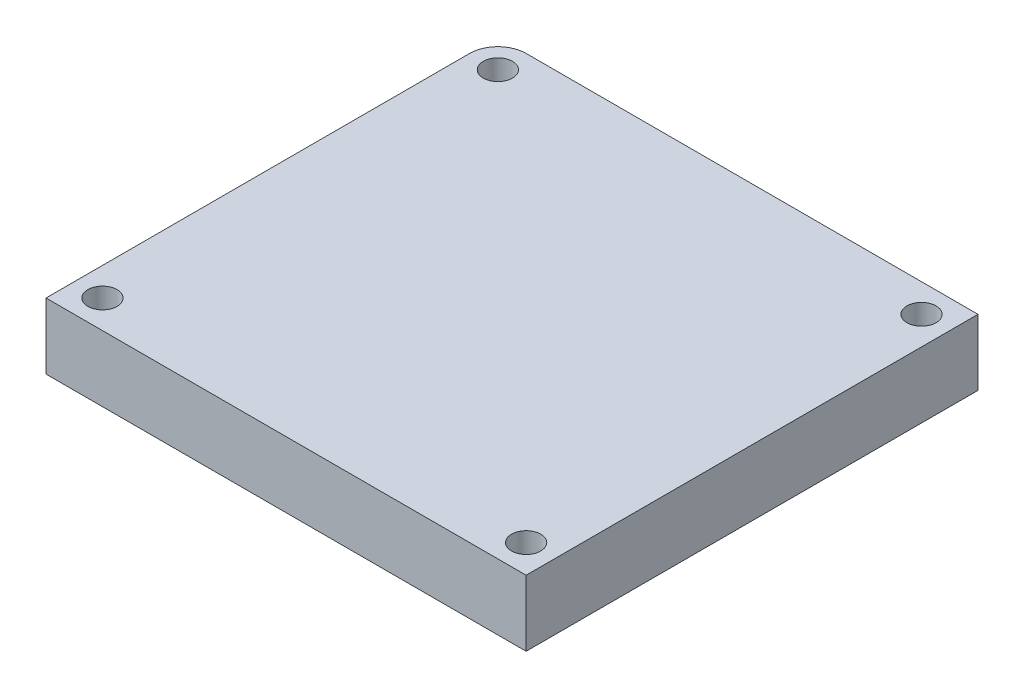
ISO-10303-21;
HEADER;
FILE_DESCRIPTION(('STEP AP214'),'2;1');
FILE_NAME('part.step','',(''),(''),'','','');
FILE_SCHEMA(('AUTOMOTIVE_DESIGN { 1 0 10303 214 1 1 1 1 }'));
ENDSEC;
DATA;
#1=APPLICATION_CONTEXT('core data for automotive mechanical design processes');
#2=APPLICATION_PROTOCOL_DEFINITION('international standard','automotive_design',2000,#1);
#3=PRODUCT_CONTEXT('',#1,'mechanical');
#4=PRODUCT('Part','Part','',(#3));
#5=PRODUCT_RELATED_PRODUCT_CATEGORY('part','',(#4));
#6=PRODUCT_DEFINITION_FORMATION('','',#4);
#7=PRODUCT_DEFINITION_CONTEXT('part definition',#1,'design');
#8=PRODUCT_DEFINITION('design','',#6,#7);
#9=PRODUCT_DEFINITION_SHAPE('','',#8);
#10=(LENGTH_UNIT() NAMED_UNIT(*) SI_UNIT(.MILLI.,.METRE.));
#11=(NAMED_UNIT(*) PLANE_ANGLE_UNIT() SI_UNIT($,.RADIAN.));
#12=(NAMED_UNIT(*) SI_UNIT($,.STERADIAN.) SOLID_ANGLE_UNIT());
#13=UNCERTAINTY_MEASURE_WITH_UNIT(LENGTH_MEASURE(1.E-05),#10,'distance_accuracy_value','');
#14=(GEOMETRIC_REPRESENTATION_CONTEXT(3) GLOBAL_UNCERTAINTY_ASSIGNED_CONTEXT((#13)) GLOBAL_UNIT_ASSIGNED_CONTEXT((#10,
#11,#12)) REPRESENTATION_CONTEXT('',''));
#15=CARTESIAN_POINT('',(0.,0.,0.));
#16=DIRECTION('',(0.,0.,1.));
#17=DIRECTION('',(1.,0.,0.));
#18=AXIS2_PLACEMENT_3D('',#15,#16,#17);
#19=CARTESIAN_POINT('',(-91.4412135173177,7.,-19.4052744204179));
#20=DIRECTION('',(0.,-1.,0.));
#21=DIRECTION('',(0.,0.,-1.));
#22=AXIS2_PLACEMENT_3D('',#19,#20,#21);
#23=CYLINDRICAL_SURFACE('',#22,3.);
#24=CARTESIAN_POINT('',(-91.4412135173177,0.,-19.4052744204179));
#25=DIRECTION('',(0.,1.,0.));
#26=DIRECTION('',(0.,0.,1.));
#27=AXIS2_PLACEMENT_3D('',#24,#25,#26);
#28=CIRCLE('',#27,3.);
#29=CARTESIAN_POINT('',(-94.4412135173177,0.,-19.4052744204179));
#30=VERTEX_POINT('',#29);
#31=CARTESIAN_POINT('',(-91.4412135173177,0.,-22.4052744204179));
#32=VERTEX_POINT('',#31);
#33=EDGE_CURVE('E121',#30,#32,#28,.F.);
#34=ORIENTED_EDGE('',*,*,#33,.F.);
#35=DIRECTION('',(0.,-1.,0.));
#36=VECTOR('',#35,1.);
#37=CARTESIAN_POINT('',(-94.4412135173177,7.,-19.4052744204179));
#38=LINE('',#37,#36);
#39=CARTESIAN_POINT('',(-94.4412135173177,7.,-19.4052744204179));
#40=VERTEX_POINT('',#39);
#41=EDGE_CURVE('E11',#40,#30,#38,.T.);
#42=ORIENTED_EDGE('',*,*,#41,.F.);
#43=CARTESIAN_POINT('',(-91.4412135173177,7.,-19.4052744204179));
#44=DIRECTION('',(0.,1.,0.));
#45=DIRECTION('',(0.,0.,1.));
#46=AXIS2_PLACEMENT_3D('',#43,#44,#45);
#47=CIRCLE('',#46,3.);
#48=CARTESIAN_POINT('',(-91.4412135173177,7.,-22.4052744204179));
#49=VERTEX_POINT('',#48);
#50=EDGE_CURVE('E144',#40,#49,#47,.F.);
#51=ORIENTED_EDGE('',*,*,#50,.T.);
#52=DIRECTION('',(0.,-1.,0.));
#53=VECTOR('',#52,1.);
#54=CARTESIAN_POINT('',(-91.4412135173177,7.,-22.4052744204179));
#55=LINE('',#54,#53);
#56=EDGE_CURVE('E51',#49,#32,#55,.T.);
#57=ORIENTED_EDGE('',*,*,#56,.T.);
#58=EDGE_LOOP('',(#34,#42,#51,#57));
#59=FACE_BOUND('',#58,.T.);
#60=ADVANCED_FACE('F35',(#59),#23,.T.);
#61=CARTESIAN_POINT('',(-94.4412135173177,7.,0.));
#62=DIRECTION('',(-1.,0.,0.));
#63=DIRECTION('',(0.,0.,1.));
#64=AXIS2_PLACEMENT_3D('',#61,#62,#63);
#65=PLANE('',#64);
#66=DIRECTION('',(0.,0.,-1.));
#67=VECTOR('',#66,1.);
#68=CARTESIAN_POINT('',(-94.4412135173177,0.,0.));
#69=LINE('',#68,#67);
#70=CARTESIAN_POINT('',(-94.4412135173177,0.,25.5947255795821));
#71=VERTEX_POINT('',#70);
#72=EDGE_CURVE('E123',#71,#30,#69,.T.);
#73=ORIENTED_EDGE('',*,*,#72,.F.);
#74=DIRECTION('',(0.,-1.,0.));
#75=VECTOR('',#74,1.);
#76=CARTESIAN_POINT('',(-94.4412135173177,7.,25.5947255795821));
#77=LINE('',#76,#75);
#78=CARTESIAN_POINT('',(-94.4412135173177,7.,25.5947255795821));
#79=VERTEX_POINT('',#78);
#80=EDGE_CURVE('E43',#79,#71,#77,.T.);
#81=ORIENTED_EDGE('',*,*,#80,.F.);
#82=DIRECTION('',(0.,0.,-1.));
#83=VECTOR('',#82,1.);
#84=CARTESIAN_POINT('',(-94.4412135173177,7.,0.));
#85=LINE('',#84,#83);
#86=EDGE_CURVE('E92',#79,#40,#85,.T.);
#87=ORIENTED_EDGE('',*,*,#86,.T.);
#88=ORIENTED_EDGE('',*,*,#41,.T.);
#89=EDGE_LOOP('',(#73,#81,#87,#88));
#90=FACE_BOUND('',#89,.T.);
#91=ADVANCED_FACE('F151',(#90),#65,.T.);
#92=CARTESIAN_POINT('',(0.,7.,25.5947255795821));
#93=DIRECTION('',(0.,0.,-1.));
#94=DIRECTION('',(-1.,0.,0.));
#95=AXIS2_PLACEMENT_3D('',#92,#93,#94);
#96=PLANE('',#95);
#97=DIRECTION('',(1.,0.,0.));
#98=VECTOR('',#97,1.);
#99=CARTESIAN_POINT('',(0.,0.,25.5947255795821));
#100=LINE('',#99,#98);
#101=CARTESIAN_POINT('',(-43.4412135173177,0.,25.5947255795821));
#102=VERTEX_POINT('',#101);
#103=EDGE_CURVE('E99',#71,#102,#100,.T.);
#104=ORIENTED_EDGE('',*,*,#103,.T.);
#105=DIRECTION('',(0.,-1.,0.));
#106=VECTOR('',#105,1.);
#107=CARTESIAN_POINT('',(-43.4412135173177,7.,25.5947255795821));
#108=LINE('',#107,#106);
#109=CARTESIAN_POINT('',(-43.4412135173177,7.,25.5947255795821));
#110=VERTEX_POINT('',#109);
#111=EDGE_CURVE('E96',#110,#102,#108,.T.);
#112=ORIENTED_EDGE('',*,*,#111,.F.);
#113=DIRECTION('',(1.,0.,0.));
#114=VECTOR('',#113,1.);
#115=CARTESIAN_POINT('',(0.,7.,25.5947255795821));
#116=LINE('',#115,#114);
#117=EDGE_CURVE('E84',#79,#110,#116,.T.);
#118=ORIENTED_EDGE('',*,*,#117,.F.);
#119=ORIENTED_EDGE('',*,*,#80,.T.);
#120=EDGE_LOOP('',(#104,#112,#118,#119));
#121=FACE_BOUND('',#120,.T.);
#122=ADVANCED_FACE('F97',(#121),#96,.F.);
#123=CARTESIAN_POINT('',(-43.4412135173177,7.,0.));
#124=DIRECTION('',(-1.,0.,0.));
#125=DIRECTION('',(0.,0.,1.));
#126=AXIS2_PLACEMENT_3D('',#123,#124,#125);
#127=PLANE('',#126);
#128=DIRECTION('',(0.,0.,-1.));
#129=VECTOR('',#128,1.);
#130=CARTESIAN_POINT('',(-43.4412135173177,0.,0.));
#131=LINE('',#130,#129);
#132=CARTESIAN_POINT('',(-43.4412135173177,0.,-22.4052744204179));
#133=VERTEX_POINT('',#132);
#134=EDGE_CURVE('E127',#102,#133,#131,.T.);
#135=ORIENTED_EDGE('',*,*,#134,.T.);
#136=DIRECTION('',(0.,-1.,0.));
#137=VECTOR('',#136,1.);
#138=CARTESIAN_POINT('',(-43.4412135173177,7.,-22.4052744204179));
#139=LINE('',#138,#137);
#140=CARTESIAN_POINT('',(-43.4412135173177,7.,-22.4052744204179));
#141=VERTEX_POINT('',#140);
#142=EDGE_CURVE('E68',#141,#133,#139,.T.);
#143=ORIENTED_EDGE('',*,*,#142,.F.);
#144=DIRECTION('',(0.,0.,-1.));
#145=VECTOR('',#144,1.);
#146=CARTESIAN_POINT('',(-43.4412135173177,7.,0.));
#147=LINE('',#146,#145);
#148=EDGE_CURVE('E90',#110,#141,#147,.T.);
#149=ORIENTED_EDGE('',*,*,#148,.F.);
#150=ORIENTED_EDGE('',*,*,#111,.T.);
#151=EDGE_LOOP('',(#135,#143,#149,#150));
#152=FACE_BOUND('',#151,.T.);
#153=ADVANCED_FACE('F103',(#152),#127,.F.);
#154=CARTESIAN_POINT('',(-46.4412135173177,7.,22.5947255795821));
#155=DIRECTION('',(0.,-1.,0.));
#156=DIRECTION('',(0.,0.,-1.));
#157=AXIS2_PLACEMENT_3D('',#154,#155,#156);
#158=CYLINDRICAL_SURFACE('',#157,1.55);
#159=CARTESIAN_POINT('',(-46.4412135173177,7.,22.5947255795821));
#160=DIRECTION('',(0.,1.,0.));
#161=DIRECTION('',(0.,0.,1.));
#162=AXIS2_PLACEMENT_3D('',#159,#160,#161);
#163=CIRCLE('',#162,1.55);
#164=CARTESIAN_POINT('',(-46.4412135173177,7.,24.1447255795821));
#165=VERTEX_POINT('',#164);
#166=EDGE_CURVE('E115',#165,#165,#163,.T.);
#167=ORIENTED_EDGE('',*,*,#166,.T.);
#168=EDGE_LOOP('',(#167));
#169=FACE_BOUND('',#168,.T.);
#170=CARTESIAN_POINT('',(-46.4412135173177,0.,22.5947255795821));
#171=DIRECTION('',(0.,1.,0.));
#172=DIRECTION('',(0.,0.,1.));
#173=AXIS2_PLACEMENT_3D('',#170,#171,#172);
#174=CIRCLE('',#173,1.55);
#175=CARTESIAN_POINT('',(-46.4412135173177,0.,24.1447255795821));
#176=VERTEX_POINT('',#175);
#177=EDGE_CURVE('E138',#176,#176,#174,.T.);
#178=ORIENTED_EDGE('',*,*,#177,.F.);
#179=EDGE_LOOP('',(#178));
#180=FACE_BOUND('',#179,.T.);
#181=ADVANCED_FACE('F176',(#169,#180),#158,.F.);
#182=CARTESIAN_POINT('',(-91.4412135173177,7.,22.5947255795821));
#183=DIRECTION('',(0.,-1.,0.));
#184=DIRECTION('',(0.,0.,-1.));
#185=AXIS2_PLACEMENT_3D('',#182,#183,#184);
#186=CYLINDRICAL_SURFACE('',#185,1.55000000000001);
#187=CARTESIAN_POINT('',(-91.4412135173177,7.,22.5947255795821));
#188=DIRECTION('',(0.,1.,0.));
#189=DIRECTION('',(0.,0.,1.));
#190=AXIS2_PLACEMENT_3D('',#187,#188,#189);
#191=CIRCLE('',#190,1.55000000000001);
#192=CARTESIAN_POINT('',(-91.4412135173177,7.,24.1447255795821));
#193=VERTEX_POINT('',#192);
#194=EDGE_CURVE('E112',#193,#193,#191,.T.);
#195=ORIENTED_EDGE('',*,*,#194,.T.);
#196=EDGE_LOOP('',(#195));
#197=FACE_BOUND('',#196,.T.);
#198=CARTESIAN_POINT('',(-91.4412135173177,0.,22.5947255795821));
#199=DIRECTION('',(0.,1.,0.));
#200=DIRECTION('',(0.,0.,1.));
#201=AXIS2_PLACEMENT_3D('',#198,#199,#200);
#202=CIRCLE('',#201,1.55000000000001);
#203=CARTESIAN_POINT('',(-91.4412135173177,0.,24.1447255795821));
#204=VERTEX_POINT('',#203);
#205=EDGE_CURVE('E135',#204,#204,#202,.T.);
#206=ORIENTED_EDGE('',*,*,#205,.F.);
#207=EDGE_LOOP('',(#206));
#208=FACE_BOUND('',#207,.T.);
#209=ADVANCED_FACE('F163',(#197,#208),#186,.F.);
#210=CARTESIAN_POINT('',(-91.4412135173177,7.,-19.4052744204179));
#211=DIRECTION('',(0.,-1.,0.));
#212=DIRECTION('',(0.,0.,-1.));
#213=AXIS2_PLACEMENT_3D('',#210,#211,#212);
#214=CYLINDRICAL_SURFACE('',#213,1.55000000000001);
#215=CARTESIAN_POINT('',(-91.4412135173177,7.,-19.4052744204179));
#216=DIRECTION('',(0.,1.,0.));
#217=DIRECTION('',(0.,0.,1.));
#218=AXIS2_PLACEMENT_3D('',#215,#216,#217);
#219=CIRCLE('',#218,1.55000000000001);
#220=CARTESIAN_POINT('',(-91.4412135173177,7.,-17.8552744204179));
#221=VERTEX_POINT('',#220);
#222=EDGE_CURVE('E106',#221,#221,#219,.T.);
#223=ORIENTED_EDGE('',*,*,#222,.T.);
#224=EDGE_LOOP('',(#223));
#225=FACE_BOUND('',#224,.T.);
#226=CARTESIAN_POINT('',(-91.4412135173177,0.,-19.4052744204179));
#227=DIRECTION('',(0.,1.,0.));
#228=DIRECTION('',(0.,0.,1.));
#229=AXIS2_PLACEMENT_3D('',#226,#227,#228);
#230=CIRCLE('',#229,1.55000000000001);
#231=CARTESIAN_POINT('',(-91.4412135173177,0.,-17.8552744204179));
#232=VERTEX_POINT('',#231);
#233=EDGE_CURVE('E132',#232,#232,#230,.T.);
#234=ORIENTED_EDGE('',*,*,#233,.F.);
#235=EDGE_LOOP('',(#234));
#236=FACE_BOUND('',#235,.T.);
#237=ADVANCED_FACE('F155',(#225,#236),#214,.F.);
#238=CARTESIAN_POINT('',(0.,7.,-22.4052744204179));
#239=DIRECTION('',(0.,0.,-1.));
#240=DIRECTION('',(-1.,0.,0.));
#241=AXIS2_PLACEMENT_3D('',#238,#239,#240);
#242=PLANE('',#241);
#243=DIRECTION('',(1.,0.,0.));
#244=VECTOR('',#243,1.);
#245=CARTESIAN_POINT('',(0.,0.,-22.4052744204179));
#246=LINE('',#245,#244);
#247=EDGE_CURVE('E129',#32,#133,#246,.T.);
#248=ORIENTED_EDGE('',*,*,#247,.F.);
#249=ORIENTED_EDGE('',*,*,#56,.F.);
#250=DIRECTION('',(1.,0.,0.));
#251=VECTOR('',#250,1.);
#252=CARTESIAN_POINT('',(0.,7.,-22.4052744204179));
#253=LINE('',#252,#251);
#254=EDGE_CURVE('E104',#49,#141,#253,.T.);
#255=ORIENTED_EDGE('',*,*,#254,.T.);
#256=ORIENTED_EDGE('',*,*,#142,.T.);
#257=EDGE_LOOP('',(#248,#249,#255,#256));
#258=FACE_BOUND('',#257,.T.);
#259=ADVANCED_FACE('F152',(#258),#242,.T.);
#260=CARTESIAN_POINT('',(-46.4412135173177,7.,-19.4052744204179));
#261=DIRECTION('',(0.,-1.,0.));
#262=DIRECTION('',(0.,0.,-1.));
#263=AXIS2_PLACEMENT_3D('',#260,#261,#262);
#264=CYLINDRICAL_SURFACE('',#263,1.55);
#265=CARTESIAN_POINT('',(-46.4412135173177,7.,-19.4052744204179));
#266=DIRECTION('',(0.,1.,0.));
#267=DIRECTION('',(0.,0.,1.));
#268=AXIS2_PLACEMENT_3D('',#265,#266,#267);
#269=CIRCLE('',#268,1.55);
#270=CARTESIAN_POINT('',(-46.4412135173177,7.,-17.8552744204179));
#271=VERTEX_POINT('',#270);
#272=EDGE_CURVE('E118',#271,#271,#269,.T.);
#273=ORIENTED_EDGE('',*,*,#272,.T.);
#274=EDGE_LOOP('',(#273));
#275=FACE_BOUND('',#274,.T.);
#276=CARTESIAN_POINT('',(-46.4412135173177,0.,-19.4052744204179));
#277=DIRECTION('',(0.,1.,0.));
#278=DIRECTION('',(0.,0.,1.));
#279=AXIS2_PLACEMENT_3D('',#276,#277,#278);
#280=CIRCLE('',#279,1.55);
#281=CARTESIAN_POINT('',(-46.4412135173177,0.,-17.8552744204179));
#282=VERTEX_POINT('',#281);
#283=EDGE_CURVE('E141',#282,#282,#280,.T.);
#284=ORIENTED_EDGE('',*,*,#283,.F.);
#285=EDGE_LOOP('',(#284));
#286=FACE_BOUND('',#285,.T.);
#287=ADVANCED_FACE('F154',(#275,#286),#264,.F.);
#288=CARTESIAN_POINT('',(0.,7.,0.));
#289=DIRECTION('',(0.,1.,0.));
#290=DIRECTION('',(0.,0.,1.));
#291=AXIS2_PLACEMENT_3D('',#288,#289,#290);
#292=PLANE('',#291);
#293=ORIENTED_EDGE('',*,*,#50,.F.);
#294=ORIENTED_EDGE('',*,*,#86,.F.);
#295=ORIENTED_EDGE('',*,*,#117,.T.);
#296=ORIENTED_EDGE('',*,*,#148,.T.);
#297=ORIENTED_EDGE('',*,*,#254,.F.);
#298=EDGE_LOOP('',(#293,#294,#295,#296,#297));
#299=FACE_BOUND('',#298,.T.);
#300=ORIENTED_EDGE('',*,*,#222,.F.);
#301=EDGE_LOOP('',(#300));
#302=FACE_BOUND('',#301,.T.);
#303=ORIENTED_EDGE('',*,*,#194,.F.);
#304=EDGE_LOOP('',(#303));
#305=FACE_BOUND('',#304,.T.);
#306=ORIENTED_EDGE('',*,*,#166,.F.);
#307=EDGE_LOOP('',(#306));
#308=FACE_BOUND('',#307,.T.);
#309=ORIENTED_EDGE('',*,*,#272,.F.);
#310=EDGE_LOOP('',(#309));
#311=FACE_BOUND('',#310,.T.);
#312=ADVANCED_FACE('F86',(#299,#302,#305,#308,#311),#292,.T.);
#313=CARTESIAN_POINT('',(0.,0.,0.));
#314=DIRECTION('',(0.,1.,0.));
#315=DIRECTION('',(0.,0.,1.));
#316=AXIS2_PLACEMENT_3D('',#313,#314,#315);
#317=PLANE('',#316);
#318=ORIENTED_EDGE('',*,*,#33,.T.);
#319=ORIENTED_EDGE('',*,*,#247,.T.);
#320=ORIENTED_EDGE('',*,*,#134,.F.);
#321=ORIENTED_EDGE('',*,*,#103,.F.);
#322=ORIENTED_EDGE('',*,*,#72,.T.);
#323=EDGE_LOOP('',(#318,#319,#320,#321,#322));
#324=FACE_BOUND('',#323,.T.);
#325=ORIENTED_EDGE('',*,*,#233,.T.);
#326=EDGE_LOOP('',(#325));
#327=FACE_BOUND('',#326,.T.);
#328=ORIENTED_EDGE('',*,*,#205,.T.);
#329=EDGE_LOOP('',(#328));
#330=FACE_BOUND('',#329,.T.);
#331=ORIENTED_EDGE('',*,*,#177,.T.);
#332=EDGE_LOOP('',(#331));
#333=FACE_BOUND('',#332,.T.);
#334=ORIENTED_EDGE('',*,*,#283,.T.);
#335=EDGE_LOOP('',(#334));
#336=FACE_BOUND('',#335,.T.);
#337=ADVANCED_FACE('F149',(#324,#327,#330,#333,#336),#317,.F.);
#338=CLOSED_SHELL('',(#60,#91,#122,#153,#181,#209,#237,#259,#287,#312,#337));
#339=MANIFOLD_SOLID_BREP('B2',#338);
#340=ADVANCED_BREP_SHAPE_REPRESENTATION('',(#18,#339),#14);
#341=SHAPE_DEFINITION_REPRESENTATION(#9,#340);
ENDSEC;
END-ISO-10303-21;
